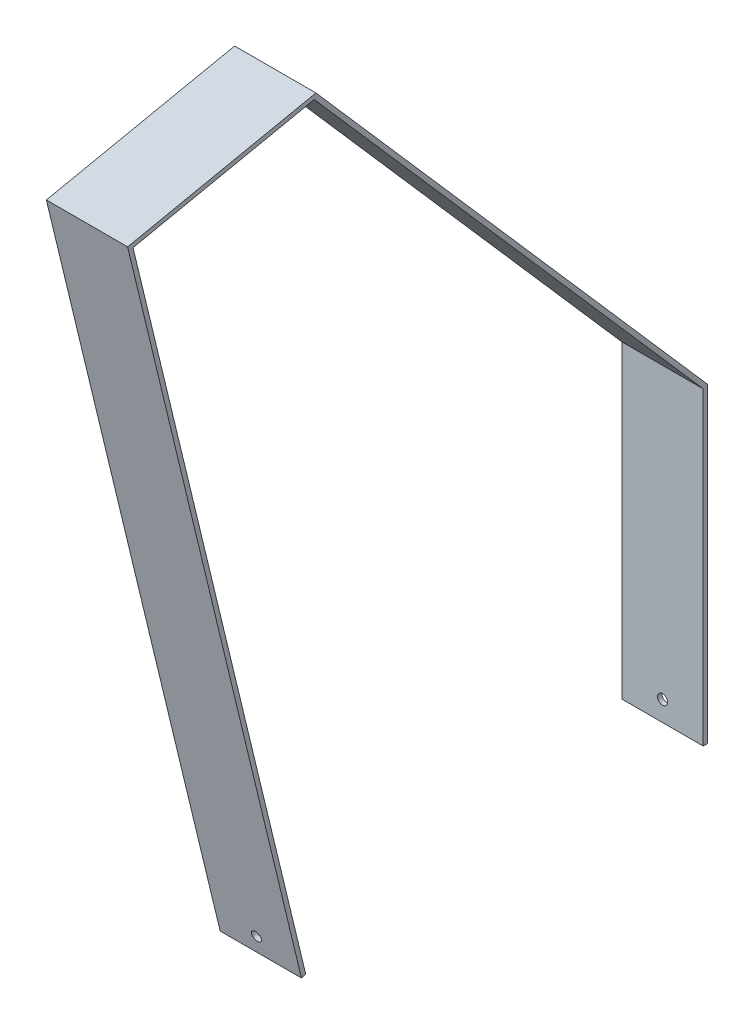
ISO-10303-21;
HEADER;
FILE_DESCRIPTION(('STEP AP214'),'2;1');
FILE_NAME('part.step','',(''),(''),'','','');
FILE_SCHEMA(('AUTOMOTIVE_DESIGN { 1 0 10303 214 1 1 1 1 }'));
ENDSEC;
DATA;
#1=APPLICATION_CONTEXT('core data for automotive mechanical design processes');
#2=APPLICATION_PROTOCOL_DEFINITION('international standard','automotive_design',2000,#1);
#3=PRODUCT_CONTEXT('',#1,'mechanical');
#4=PRODUCT('Part','Part','',(#3));
#5=PRODUCT_RELATED_PRODUCT_CATEGORY('part','',(#4));
#6=PRODUCT_DEFINITION_FORMATION('','',#4);
#7=PRODUCT_DEFINITION_CONTEXT('part definition',#1,'design');
#8=PRODUCT_DEFINITION('design','',#6,#7);
#9=PRODUCT_DEFINITION_SHAPE('','',#8);
#10=(LENGTH_UNIT() NAMED_UNIT(*) SI_UNIT(.MILLI.,.METRE.));
#11=(NAMED_UNIT(*) PLANE_ANGLE_UNIT() SI_UNIT($,.RADIAN.));
#12=(NAMED_UNIT(*) SI_UNIT($,.STERADIAN.) SOLID_ANGLE_UNIT());
#13=UNCERTAINTY_MEASURE_WITH_UNIT(LENGTH_MEASURE(1.E-05),#10,'distance_accuracy_value','');
#14=(GEOMETRIC_REPRESENTATION_CONTEXT(3) GLOBAL_UNCERTAINTY_ASSIGNED_CONTEXT((#13)) GLOBAL_UNIT_ASSIGNED_CONTEXT((#10,
#11,#12)) REPRESENTATION_CONTEXT('',''));
#15=CARTESIAN_POINT('',(0.,0.,0.));
#16=DIRECTION('',(0.,0.,1.));
#17=DIRECTION('',(1.,0.,0.));
#18=AXIS2_PLACEMENT_3D('',#15,#16,#17);
#19=CARTESIAN_POINT('',(93.2682000001347,78.0400000000939,-1089.6689681282));
#20=DIRECTION('',(0.,1.,0.));
#21=DIRECTION('',(-1.,0.,0.));
#22=AXIS2_PLACEMENT_3D('',#19,#20,#21);
#23=PLANE('',#22);
#24=DIRECTION('',(0.,0.,1.));
#25=VECTOR('',#24,1.);
#26=CARTESIAN_POINT('',(141.868200000135,78.0400000000939,-1089.6689681282));
#27=LINE('',#26,#25);
#28=CARTESIAN_POINT('',(141.868200000135,78.0400000000939,-1089.6689681282));
#29=VERTEX_POINT('',#28);
#30=CARTESIAN_POINT('',(141.868200000135,78.0400000000939,-1087.0089681282));
#31=VERTEX_POINT('',#30);
#32=EDGE_CURVE('E146',#29,#31,#27,.T.);
#33=ORIENTED_EDGE('',*,*,#32,.T.);
#34=DIRECTION('',(1.,0.,0.));
#35=VECTOR('',#34,1.);
#36=CARTESIAN_POINT('',(93.2682000001347,78.0400000000939,-1087.0089681282));
#37=LINE('',#36,#35);
#38=CARTESIAN_POINT('',(93.2682000001347,78.0400000000939,-1087.0089681282));
#39=VERTEX_POINT('',#38);
#40=EDGE_CURVE('E11',#39,#31,#37,.T.);
#41=ORIENTED_EDGE('',*,*,#40,.F.);
#42=DIRECTION('',(0.,0.,1.));
#43=VECTOR('',#42,1.);
#44=CARTESIAN_POINT('',(93.2682000001347,78.0400000000939,-1089.6689681282));
#45=LINE('',#44,#43);
#46=CARTESIAN_POINT('',(93.2682000001347,78.0400000000939,-1089.6689681282));
#47=VERTEX_POINT('',#46);
#48=EDGE_CURVE('E165',#47,#39,#45,.T.);
#49=ORIENTED_EDGE('',*,*,#48,.F.);
#50=DIRECTION('',(1.,0.,0.));
#51=VECTOR('',#50,1.);
#52=CARTESIAN_POINT('',(93.2682000001347,78.0400000000939,-1089.6689681282));
#53=LINE('',#52,#51);
#54=EDGE_CURVE('E142',#47,#29,#53,.T.);
#55=ORIENTED_EDGE('',*,*,#54,.T.);
#56=EDGE_LOOP('',(#33,#41,#49,#55));
#57=FACE_BOUND('',#56,.T.);
#58=ADVANCED_FACE('F37',(#57),#23,.F.);
#59=CARTESIAN_POINT('',(93.2682000001347,78.0400000000939,-1087.0089681282));
#60=DIRECTION('',(0.,0.,-1.));
#61=DIRECTION('',(-1.,0.,0.));
#62=AXIS2_PLACEMENT_3D('',#59,#60,#61);
#63=PLANE('',#62);
#64=CARTESIAN_POINT('',(117.568200000135,90.0409021399366,-1087.0089681282));
#65=DIRECTION('',(0.,0.,-1.));
#66=DIRECTION('',(-1.,0.,0.));
#67=AXIS2_PLACEMENT_3D('',#64,#65,#66);
#68=CIRCLE('',#67,2.99999999999999);
#69=CARTESIAN_POINT('',(114.568200000135,90.0409021399366,-1087.0089681282));
#70=VERTEX_POINT('',#69);
#71=EDGE_CURVE('E150',#70,#70,#68,.T.);
#72=ORIENTED_EDGE('',*,*,#71,.T.);
#73=EDGE_LOOP('',(#72));
#74=FACE_BOUND('',#73,.T.);
#75=DIRECTION('',(0.,1.,0.));
#76=VECTOR('',#75,1.);
#77=CARTESIAN_POINT('',(141.868200000135,78.0400000000939,-1087.0089681282));
#78=LINE('',#77,#76);
#79=CARTESIAN_POINT('',(141.868200000135,263.041459528692,-1087.0089681282));
#80=VERTEX_POINT('',#79);
#81=EDGE_CURVE('E149',#31,#80,#78,.T.);
#82=ORIENTED_EDGE('',*,*,#81,.T.);
#83=DIRECTION('',(1.,0.,0.));
#84=VECTOR('',#83,1.);
#85=CARTESIAN_POINT('',(93.2682000001348,263.041459528692,-1087.0089681282));
#86=LINE('',#85,#84);
#87=CARTESIAN_POINT('',(93.2682000001348,263.041459528692,-1087.0089681282));
#88=VERTEX_POINT('',#87);
#89=EDGE_CURVE('E46',#88,#80,#86,.T.);
#90=ORIENTED_EDGE('',*,*,#89,.F.);
#91=DIRECTION('',(0.,1.,0.));
#92=VECTOR('',#91,1.);
#93=CARTESIAN_POINT('',(93.2682000001347,78.0400000000939,-1087.0089681282));
#94=LINE('',#93,#92);
#95=EDGE_CURVE('E103',#39,#88,#94,.T.);
#96=ORIENTED_EDGE('',*,*,#95,.F.);
#97=ORIENTED_EDGE('',*,*,#40,.T.);
#98=EDGE_LOOP('',(#82,#90,#96,#97));
#99=FACE_BOUND('',#98,.T.);
#100=ADVANCED_FACE('F238',(#74,#99),#63,.F.);
#101=CARTESIAN_POINT('',(93.2682000001348,263.041459528692,-1087.0089681282));
#102=DIRECTION('',(0.,0.658050769465754,-0.75297356182374));
#103=DIRECTION('',(0.,0.75297356182374,0.658050769465754));
#104=AXIS2_PLACEMENT_3D('',#101,#102,#103);
#105=PLANE('',#104);
#106=DIRECTION('',(0.,0.75297356182374,0.658050769465754));
#107=VECTOR('',#106,1.);
#108=CARTESIAN_POINT('',(141.868200000135,263.041459528692,-1087.0089681282));
#109=LINE('',#108,#107);
#110=CARTESIAN_POINT('',(141.868200000135,529.177744723891,-854.422864000876));
#111=VERTEX_POINT('',#110);
#112=EDGE_CURVE('E152',#80,#111,#109,.T.);
#113=ORIENTED_EDGE('',*,*,#112,.T.);
#114=DIRECTION('',(1.,0.,0.));
#115=VECTOR('',#114,1.);
#116=CARTESIAN_POINT('',(93.2682000001348,529.177744723891,-854.422864000876));
#117=LINE('',#116,#115);
#118=CARTESIAN_POINT('',(93.2682000001348,529.177744723891,-854.422864000876));
#119=VERTEX_POINT('',#118);
#120=EDGE_CURVE('E178',#119,#111,#117,.T.);
#121=ORIENTED_EDGE('',*,*,#120,.F.);
#122=DIRECTION('',(0.,0.75297356182374,0.658050769465754));
#123=VECTOR('',#122,1.);
#124=CARTESIAN_POINT('',(93.2682000001348,263.041459528692,-1087.0089681282));
#125=LINE('',#124,#123);
#126=EDGE_CURVE('E187',#88,#119,#125,.T.);
#127=ORIENTED_EDGE('',*,*,#126,.F.);
#128=ORIENTED_EDGE('',*,*,#89,.T.);
#129=EDGE_LOOP('',(#113,#121,#127,#128));
#130=FACE_BOUND('',#129,.T.);
#131=ADVANCED_FACE('F185',(#130),#105,.F.);
#132=CARTESIAN_POINT('',(93.2682000001348,529.177744723891,-854.422864000876));
#133=DIRECTION('',(0.,0.979037174719064,0.203681640110522));
#134=DIRECTION('',(0.,-0.203681640110523,0.979037174719064));
#135=AXIS2_PLACEMENT_3D('',#132,#133,#134);
#136=PLANE('',#135);
#137=DIRECTION('',(0.,-0.203681640110523,0.979037174719064));
#138=VECTOR('',#137,1.);
#139=CARTESIAN_POINT('',(141.868200000135,529.177744723891,-854.422864000876));
#140=LINE('',#139,#138);
#141=CARTESIAN_POINT('',(141.868200000135,506.63020944807,-746.043555874034));
#142=VERTEX_POINT('',#141);
#143=EDGE_CURVE('E154',#111,#142,#140,.T.);
#144=ORIENTED_EDGE('',*,*,#143,.T.);
#145=DIRECTION('',(1.,0.,0.));
#146=VECTOR('',#145,1.);
#147=CARTESIAN_POINT('',(93.2682000001348,506.63020944807,-746.043555874034));
#148=LINE('',#147,#146);
#149=CARTESIAN_POINT('',(93.2682000001348,506.63020944807,-746.043555874034));
#150=VERTEX_POINT('',#149);
#151=EDGE_CURVE('E175',#150,#142,#148,.T.);
#152=ORIENTED_EDGE('',*,*,#151,.F.);
#153=DIRECTION('',(0.,-0.203681640110523,0.979037174719064));
#154=VECTOR('',#153,1.);
#155=CARTESIAN_POINT('',(93.2682000001348,529.177744723891,-854.422864000876));
#156=LINE('',#155,#154);
#157=EDGE_CURVE('E205',#119,#150,#156,.T.);
#158=ORIENTED_EDGE('',*,*,#157,.F.);
#159=ORIENTED_EDGE('',*,*,#120,.T.);
#160=EDGE_LOOP('',(#144,#152,#158,#159));
#161=FACE_BOUND('',#160,.T.);
#162=ADVANCED_FACE('F196',(#161),#136,.F.);
#163=CARTESIAN_POINT('',(93.2682000001348,506.63020944807,-746.043555874034));
#164=DIRECTION('',(0.,-0.234614524174792,0.972088486222441));
#165=DIRECTION('',(0.,-0.972088486222441,-0.234614524174792));
#166=AXIS2_PLACEMENT_3D('',#163,#164,#165);
#167=PLANE('',#166);
#168=CARTESIAN_POINT('',(117.568200000135,89.3355983247003,-846.758025818914));
#169=DIRECTION('',(0.,0.234614524174792,-0.972088486222441));
#170=DIRECTION('',(0.,0.972088486222441,0.234614524174792));
#171=AXIS2_PLACEMENT_3D('',#168,#169,#170);
#172=CIRCLE('',#171,3.);
#173=CARTESIAN_POINT('',(117.568200000135,92.2518637833676,-846.05418224639));
#174=VERTEX_POINT('',#173);
#175=EDGE_CURVE('E218',#174,#174,#172,.T.);
#176=ORIENTED_EDGE('',*,*,#175,.F.);
#177=EDGE_LOOP('',(#176));
#178=FACE_BOUND('',#177,.T.);
#179=DIRECTION('',(0.,-0.972088486222441,-0.234614524174792));
#180=VECTOR('',#179,1.);
#181=CARTESIAN_POINT('',(141.868200000135,506.63020944807,-746.043555874034));
#182=LINE('',#181,#180);
#183=CARTESIAN_POINT('',(141.868200000135,78.6640746343987,-849.333608688483));
#184=VERTEX_POINT('',#183);
#185=EDGE_CURVE('E156',#142,#184,#182,.T.);
#186=ORIENTED_EDGE('',*,*,#185,.T.);
#187=DIRECTION('',(1.,0.,0.));
#188=VECTOR('',#187,1.);
#189=CARTESIAN_POINT('',(93.2682000001347,78.6640746343987,-849.333608688483));
#190=LINE('',#189,#188);
#191=CARTESIAN_POINT('',(93.2682000001347,78.6640746343987,-849.333608688483));
#192=VERTEX_POINT('',#191);
#193=EDGE_CURVE('E172',#192,#184,#190,.T.);
#194=ORIENTED_EDGE('',*,*,#193,.F.);
#195=DIRECTION('',(0.,-0.972088486222441,-0.234614524174792));
#196=VECTOR('',#195,1.);
#197=CARTESIAN_POINT('',(93.2682000001348,506.63020944807,-746.043555874034));
#198=LINE('',#197,#196);
#199=EDGE_CURVE('E202',#150,#192,#198,.T.);
#200=ORIENTED_EDGE('',*,*,#199,.F.);
#201=ORIENTED_EDGE('',*,*,#151,.T.);
#202=EDGE_LOOP('',(#186,#194,#200,#201));
#203=FACE_BOUND('',#202,.T.);
#204=ADVANCED_FACE('F200',(#178,#203),#167,.F.);
#205=CARTESIAN_POINT('',(93.2682000001347,78.6640746343987,-849.333608688483));
#206=DIRECTION('',(0.,0.972088486222446,0.23461452417477));
#207=DIRECTION('',(0.,-0.23461452417477,0.972088486222446));
#208=AXIS2_PLACEMENT_3D('',#205,#206,#207);
#209=PLANE('',#208);
#210=DIRECTION('',(0.,-0.23461452417477,0.972088486222446));
#211=VECTOR('',#210,1.);
#212=CARTESIAN_POINT('',(141.868200000135,78.6640746343987,-849.333608688483));
#213=LINE('',#212,#211);
#214=CARTESIAN_POINT('',(141.868200000135,78.0400000000939,-846.747853315131));
#215=VERTEX_POINT('',#214);
#216=EDGE_CURVE('E158',#184,#215,#213,.T.);
#217=ORIENTED_EDGE('',*,*,#216,.T.);
#218=DIRECTION('',(1.,0.,0.));
#219=VECTOR('',#218,1.);
#220=CARTESIAN_POINT('',(93.2682000001347,78.0400000000939,-846.747853315131));
#221=LINE('',#220,#219);
#222=CARTESIAN_POINT('',(93.2682000001347,78.0400000000939,-846.747853315131));
#223=VERTEX_POINT('',#222);
#224=EDGE_CURVE('E169',#223,#215,#221,.T.);
#225=ORIENTED_EDGE('',*,*,#224,.F.);
#226=DIRECTION('',(0.,-0.23461452417477,0.972088486222446));
#227=VECTOR('',#226,1.);
#228=CARTESIAN_POINT('',(93.2682000001347,78.6640746343987,-849.333608688483));
#229=LINE('',#228,#227);
#230=EDGE_CURVE('E204',#192,#223,#229,.T.);
#231=ORIENTED_EDGE('',*,*,#230,.F.);
#232=ORIENTED_EDGE('',*,*,#193,.T.);
#233=EDGE_LOOP('',(#217,#225,#231,#232));
#234=FACE_BOUND('',#233,.T.);
#235=ADVANCED_FACE('F250',(#234),#209,.F.);
#236=CARTESIAN_POINT('',(93.2682000001348,508.675199396635,-742.813619105699));
#237=DIRECTION('',(0.,0.234614524174791,-0.972088486222441));
#238=DIRECTION('',(0.,0.972088486222441,0.234614524174791));
#239=AXIS2_PLACEMENT_3D('',#236,#237,#238);
#240=PLANE('',#239);
#241=CARTESIAN_POINT('',(117.568200000135,88.7115236903953,-844.172270445562));
#242=DIRECTION('',(0.,0.234614524174791,-0.972088486222441));
#243=DIRECTION('',(0.,0.972088486222441,0.234614524174791));
#244=AXIS2_PLACEMENT_3D('',#241,#242,#243);
#245=CIRCLE('',#244,3.);
#246=CARTESIAN_POINT('',(117.568200000135,91.6277891490626,-843.468426873038));
#247=VERTEX_POINT('',#246);
#248=EDGE_CURVE('E40',#247,#247,#245,.T.);
#249=ORIENTED_EDGE('',*,*,#248,.T.);
#250=EDGE_LOOP('',(#249));
#251=FACE_BOUND('',#250,.T.);
#252=DIRECTION('',(0.,0.972088486222441,0.234614524174791));
#253=VECTOR('',#252,1.);
#254=CARTESIAN_POINT('',(141.868200000135,508.675199396635,-742.813619105699));
#255=LINE('',#254,#253);
#256=CARTESIAN_POINT('',(141.868200000135,508.675199396635,-742.813619105699));
#257=VERTEX_POINT('',#256);
#258=EDGE_CURVE('E160',#215,#257,#255,.T.);
#259=ORIENTED_EDGE('',*,*,#258,.T.);
#260=DIRECTION('',(1.,0.,0.));
#261=VECTOR('',#260,1.);
#262=CARTESIAN_POINT('',(93.2682000001348,508.675199396635,-742.813619105699));
#263=LINE('',#262,#261);
#264=CARTESIAN_POINT('',(93.2682000001348,508.675199396635,-742.813619105699));
#265=VERTEX_POINT('',#264);
#266=EDGE_CURVE('E137',#265,#257,#263,.T.);
#267=ORIENTED_EDGE('',*,*,#266,.F.);
#268=DIRECTION('',(0.,0.972088486222441,0.234614524174791));
#269=VECTOR('',#268,1.);
#270=CARTESIAN_POINT('',(93.2682000001348,508.675199396635,-742.813619105699));
#271=LINE('',#270,#269);
#272=EDGE_CURVE('E128',#223,#265,#271,.T.);
#273=ORIENTED_EDGE('',*,*,#272,.F.);
#274=ORIENTED_EDGE('',*,*,#224,.T.);
#275=EDGE_LOOP('',(#259,#267,#273,#274));
#276=FACE_BOUND('',#275,.T.);
#277=ADVANCED_FACE('F225',(#251,#276),#240,.F.);
#278=CARTESIAN_POINT('',(93.2682000001348,532.098588009345,-855.402894198391));
#279=DIRECTION('',(0.,-0.979037174719064,-0.203681640110522));
#280=DIRECTION('',(0.,0.203681640110523,-0.979037174719064));
#281=AXIS2_PLACEMENT_3D('',#278,#279,#280);
#282=PLANE('',#281);
#283=DIRECTION('',(0.,0.203681640110522,-0.979037174719064));
#284=VECTOR('',#283,1.);
#285=CARTESIAN_POINT('',(141.868200000135,532.098588009345,-855.402894198391));
#286=LINE('',#285,#284);
#287=CARTESIAN_POINT('',(141.868200000135,532.098588009345,-855.402894198391));
#288=VERTEX_POINT('',#287);
#289=EDGE_CURVE('E136',#257,#288,#286,.T.);
#290=ORIENTED_EDGE('',*,*,#289,.T.);
#291=DIRECTION('',(1.,0.,0.));
#292=VECTOR('',#291,1.);
#293=CARTESIAN_POINT('',(93.2682000001348,532.098588009345,-855.402894198391));
#294=LINE('',#293,#292);
#295=CARTESIAN_POINT('',(93.2682000001348,532.098588009345,-855.402894198391));
#296=VERTEX_POINT('',#295);
#297=EDGE_CURVE('E133',#296,#288,#294,.T.);
#298=ORIENTED_EDGE('',*,*,#297,.F.);
#299=DIRECTION('',(0.,0.203681640110522,-0.979037174719064));
#300=VECTOR('',#299,1.);
#301=CARTESIAN_POINT('',(93.2682000001348,532.098588009345,-855.402894198391));
#302=LINE('',#301,#300);
#303=EDGE_CURVE('E122',#265,#296,#302,.T.);
#304=ORIENTED_EDGE('',*,*,#303,.F.);
#305=ORIENTED_EDGE('',*,*,#266,.T.);
#306=EDGE_LOOP('',(#290,#298,#304,#305));
#307=FACE_BOUND('',#306,.T.);
#308=ADVANCED_FACE('F134',(#307),#282,.F.);
#309=CARTESIAN_POINT('',(93.2682000001348,264.040000000094,-1089.6689681282));
#310=DIRECTION('',(0.,-0.658050769465754,0.75297356182374));
#311=DIRECTION('',(0.,-0.75297356182374,-0.658050769465754));
#312=AXIS2_PLACEMENT_3D('',#309,#310,#311);
#313=PLANE('',#312);
#314=DIRECTION('',(0.,-0.75297356182374,-0.658050769465754));
#315=VECTOR('',#314,1.);
#316=CARTESIAN_POINT('',(141.868200000135,264.040000000094,-1089.6689681282));
#317=LINE('',#316,#315);
#318=CARTESIAN_POINT('',(141.868200000135,264.040000000094,-1089.6689681282));
#319=VERTEX_POINT('',#318);
#320=EDGE_CURVE('E89',#288,#319,#317,.T.);
#321=ORIENTED_EDGE('',*,*,#320,.T.);
#322=DIRECTION('',(1.,0.,0.));
#323=VECTOR('',#322,1.);
#324=CARTESIAN_POINT('',(93.2682000001348,264.040000000094,-1089.6689681282));
#325=LINE('',#324,#323);
#326=CARTESIAN_POINT('',(93.2682000001348,264.040000000094,-1089.6689681282));
#327=VERTEX_POINT('',#326);
#328=EDGE_CURVE('E138',#327,#319,#325,.T.);
#329=ORIENTED_EDGE('',*,*,#328,.F.);
#330=DIRECTION('',(0.,-0.75297356182374,-0.658050769465754));
#331=VECTOR('',#330,1.);
#332=CARTESIAN_POINT('',(93.2682000001348,264.040000000094,-1089.6689681282));
#333=LINE('',#332,#331);
#334=EDGE_CURVE('E126',#296,#327,#333,.T.);
#335=ORIENTED_EDGE('',*,*,#334,.F.);
#336=ORIENTED_EDGE('',*,*,#297,.T.);
#337=EDGE_LOOP('',(#321,#329,#335,#336));
#338=FACE_BOUND('',#337,.T.);
#339=ADVANCED_FACE('F140',(#338),#313,.F.);
#340=CARTESIAN_POINT('',(93.2682000001347,78.0400000000939,-1089.6689681282));
#341=DIRECTION('',(0.,0.,1.));
#342=DIRECTION('',(1.,0.,0.));
#343=AXIS2_PLACEMENT_3D('',#340,#341,#342);
#344=PLANE('',#343);
#345=CARTESIAN_POINT('',(117.568200000135,90.0409021399366,-1089.6689681282));
#346=DIRECTION('',(0.,0.,-1.));
#347=DIRECTION('',(-1.,0.,0.));
#348=AXIS2_PLACEMENT_3D('',#345,#346,#347);
#349=CIRCLE('',#348,2.99999999999999);
#350=CARTESIAN_POINT('',(114.568200000135,90.0409021399366,-1089.6689681282));
#351=VERTEX_POINT('',#350);
#352=EDGE_CURVE('E215',#351,#351,#349,.T.);
#353=ORIENTED_EDGE('',*,*,#352,.F.);
#354=EDGE_LOOP('',(#353));
#355=FACE_BOUND('',#354,.T.);
#356=DIRECTION('',(0.,-1.,0.));
#357=VECTOR('',#356,1.);
#358=CARTESIAN_POINT('',(141.868200000135,78.0400000000939,-1089.6689681282));
#359=LINE('',#358,#357);
#360=EDGE_CURVE('E95',#319,#29,#359,.T.);
#361=ORIENTED_EDGE('',*,*,#360,.T.);
#362=ORIENTED_EDGE('',*,*,#54,.F.);
#363=DIRECTION('',(0.,-1.,0.));
#364=VECTOR('',#363,1.);
#365=CARTESIAN_POINT('',(93.2682000001347,78.0400000000939,-1089.6689681282));
#366=LINE('',#365,#364);
#367=EDGE_CURVE('E54',#327,#47,#366,.T.);
#368=ORIENTED_EDGE('',*,*,#367,.F.);
#369=ORIENTED_EDGE('',*,*,#328,.T.);
#370=EDGE_LOOP('',(#361,#362,#368,#369));
#371=FACE_BOUND('',#370,.T.);
#372=ADVANCED_FACE('F318',(#355,#371),#344,.F.);
#373=CARTESIAN_POINT('',(93.2682000001347,0.,0.));
#374=DIRECTION('',(-1.,0.,0.));
#375=DIRECTION('',(0.,-1.,0.));
#376=AXIS2_PLACEMENT_3D('',#373,#374,#375);
#377=PLANE('',#376);
#378=ORIENTED_EDGE('',*,*,#48,.T.);
#379=ORIENTED_EDGE('',*,*,#95,.T.);
#380=ORIENTED_EDGE('',*,*,#126,.T.);
#381=ORIENTED_EDGE('',*,*,#157,.T.);
#382=ORIENTED_EDGE('',*,*,#199,.T.);
#383=ORIENTED_EDGE('',*,*,#230,.T.);
#384=ORIENTED_EDGE('',*,*,#272,.T.);
#385=ORIENTED_EDGE('',*,*,#303,.T.);
#386=ORIENTED_EDGE('',*,*,#334,.T.);
#387=ORIENTED_EDGE('',*,*,#367,.T.);
#388=EDGE_LOOP('',(#378,#379,#380,#381,#382,#383,#384,#385,#386,#387));
#389=FACE_BOUND('',#388,.T.);
#390=ADVANCED_FACE('F124',(#389),#377,.T.);
#391=CARTESIAN_POINT('',(141.868200000135,0.,0.));
#392=DIRECTION('',(-1.,0.,0.));
#393=DIRECTION('',(0.,-1.,0.));
#394=AXIS2_PLACEMENT_3D('',#391,#392,#393);
#395=PLANE('',#394);
#396=ORIENTED_EDGE('',*,*,#32,.F.);
#397=ORIENTED_EDGE('',*,*,#360,.F.);
#398=ORIENTED_EDGE('',*,*,#320,.F.);
#399=ORIENTED_EDGE('',*,*,#289,.F.);
#400=ORIENTED_EDGE('',*,*,#258,.F.);
#401=ORIENTED_EDGE('',*,*,#216,.F.);
#402=ORIENTED_EDGE('',*,*,#185,.F.);
#403=ORIENTED_EDGE('',*,*,#143,.F.);
#404=ORIENTED_EDGE('',*,*,#112,.F.);
#405=ORIENTED_EDGE('',*,*,#81,.F.);
#406=EDGE_LOOP('',(#396,#397,#398,#399,#400,#401,#402,#403,#404,#405));
#407=FACE_BOUND('',#406,.T.);
#408=ADVANCED_FACE('F191',(#407),#395,.F.);
#409=CARTESIAN_POINT('',(117.568200000135,90.0409021399366,-1079.6689681282));
#410=DIRECTION('',(0.,0.,-1.));
#411=DIRECTION('',(-1.,0.,0.));
#412=AXIS2_PLACEMENT_3D('',#409,#410,#411);
#413=CYLINDRICAL_SURFACE('',#412,2.99999999999999);
#414=ORIENTED_EDGE('',*,*,#352,.T.);
#415=EDGE_LOOP('',(#414));
#416=FACE_BOUND('',#415,.T.);
#417=ORIENTED_EDGE('',*,*,#71,.F.);
#418=EDGE_LOOP('',(#417));
#419=FACE_BOUND('',#418,.T.);
#420=ADVANCED_FACE('F230',(#416,#419),#413,.F.);
#421=CARTESIAN_POINT('',(117.568200000135,86.9894530829524,-837.03714095669));
#422=DIRECTION('',(0.,0.234614524174792,-0.972088486222441));
#423=DIRECTION('',(0.,0.972088486222441,0.234614524174792));
#424=AXIS2_PLACEMENT_3D('',#421,#422,#423);
#425=CYLINDRICAL_SURFACE('',#424,3.);
#426=ORIENTED_EDGE('',*,*,#175,.T.);
#427=EDGE_LOOP('',(#426));
#428=FACE_BOUND('',#427,.T.);
#429=ORIENTED_EDGE('',*,*,#248,.F.);
#430=EDGE_LOOP('',(#429));
#431=FACE_BOUND('',#430,.T.);
#432=ADVANCED_FACE('F228',(#428,#431),#425,.F.);
#433=CLOSED_SHELL('',(#58,#100,#131,#162,#204,#235,#277,#308,#339,#372,#390,#408,#420,#432));
#434=MANIFOLD_SOLID_BREP('B2',#433);
#435=ADVANCED_BREP_SHAPE_REPRESENTATION('',(#18,#434),#14);
#436=SHAPE_DEFINITION_REPRESENTATION(#9,#435);
ENDSEC;
END-ISO-10303-21;
